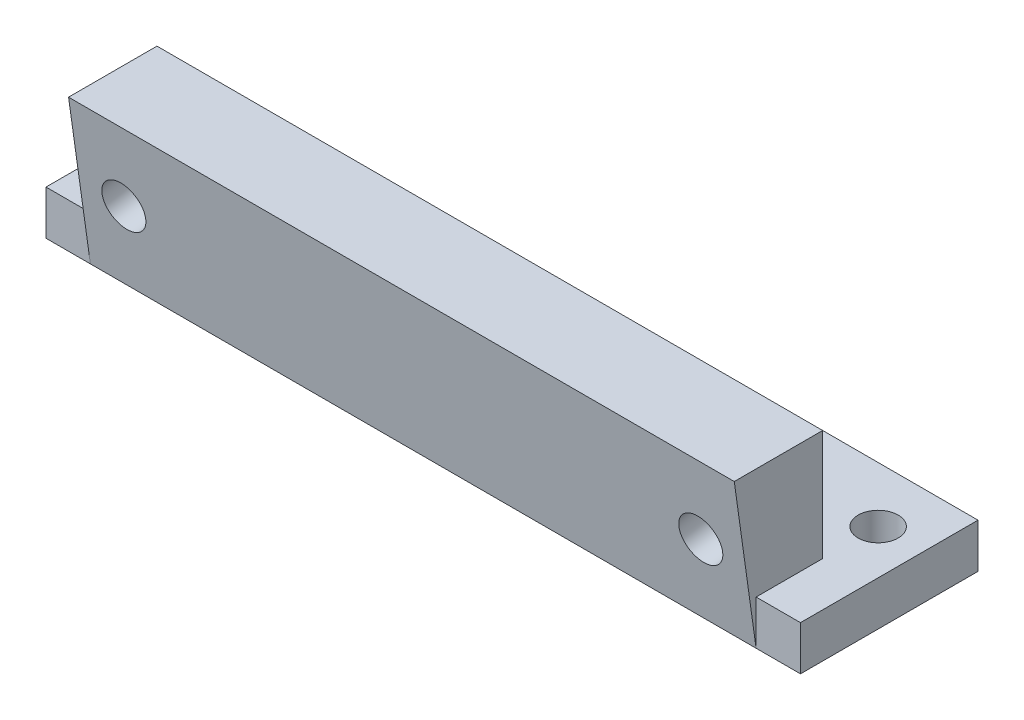
ISO-10303-21;
HEADER;
FILE_DESCRIPTION(('STEP AP214'),'2;1');
FILE_NAME('part.step','',(''),(''),'','','');
FILE_SCHEMA(('AUTOMOTIVE_DESIGN { 1 0 10303 214 1 1 1 1 }'));
ENDSEC;
DATA;
#1=APPLICATION_CONTEXT('core data for automotive mechanical design processes');
#2=APPLICATION_PROTOCOL_DEFINITION('international standard','automotive_design',2000,#1);
#3=PRODUCT_CONTEXT('',#1,'mechanical');
#4=PRODUCT('Part','Part','',(#3));
#5=PRODUCT_RELATED_PRODUCT_CATEGORY('part','',(#4));
#6=PRODUCT_DEFINITION_FORMATION('','',#4);
#7=PRODUCT_DEFINITION_CONTEXT('part definition',#1,'design');
#8=PRODUCT_DEFINITION('design','',#6,#7);
#9=PRODUCT_DEFINITION_SHAPE('','',#8);
#10=(LENGTH_UNIT() NAMED_UNIT(*) SI_UNIT(.MILLI.,.METRE.));
#11=(NAMED_UNIT(*) PLANE_ANGLE_UNIT() SI_UNIT($,.RADIAN.));
#12=(NAMED_UNIT(*) SI_UNIT($,.STERADIAN.) SOLID_ANGLE_UNIT());
#13=UNCERTAINTY_MEASURE_WITH_UNIT(LENGTH_MEASURE(1.E-05),#10,'distance_accuracy_value','');
#14=(GEOMETRIC_REPRESENTATION_CONTEXT(3) GLOBAL_UNCERTAINTY_ASSIGNED_CONTEXT((#13)) GLOBAL_UNIT_ASSIGNED_CONTEXT((#10,
#11,#12)) REPRESENTATION_CONTEXT('',''));
#15=CARTESIAN_POINT('',(0.,0.,0.));
#16=DIRECTION('',(0.,0.,1.));
#17=DIRECTION('',(1.,0.,0.));
#18=AXIS2_PLACEMENT_3D('',#15,#16,#17);
#19=CARTESIAN_POINT('',(-21.59,2.54,5.08));
#20=DIRECTION('',(0.,0.,-1.));
#21=DIRECTION('',(-1.,0.,0.));
#22=AXIS2_PLACEMENT_3D('',#19,#20,#21);
#23=PLANE('',#22);
#24=DIRECTION('',(0.,1.,0.));
#25=VECTOR('',#24,1.);
#26=CARTESIAN_POINT('',(19.05,0.,5.08));
#27=LINE('',#26,#25);
#28=CARTESIAN_POINT('',(19.05,0.,5.08));
#29=VERTEX_POINT('',#28);
#30=CARTESIAN_POINT('',(19.05,2.54,5.08));
#31=VERTEX_POINT('',#30);
#32=EDGE_CURVE('E50',#29,#31,#27,.T.);
#33=ORIENTED_EDGE('',*,*,#32,.F.);
#34=DIRECTION('',(1.,0.,0.));
#35=VECTOR('',#34,1.);
#36=CARTESIAN_POINT('',(-21.59,0.,5.08));
#37=LINE('',#36,#35);
#38=CARTESIAN_POINT('',(21.59,0.,5.08));
#39=VERTEX_POINT('',#38);
#40=EDGE_CURVE('E117',#29,#39,#37,.T.);
#41=ORIENTED_EDGE('',*,*,#40,.T.);
#42=DIRECTION('',(0.,-1.,0.));
#43=VECTOR('',#42,1.);
#44=CARTESIAN_POINT('',(21.59,2.54,5.08));
#45=LINE('',#44,#43);
#46=CARTESIAN_POINT('',(21.59,2.54,5.08));
#47=VERTEX_POINT('',#46);
#48=EDGE_CURVE('E170',#47,#39,#45,.T.);
#49=ORIENTED_EDGE('',*,*,#48,.F.);
#50=DIRECTION('',(1.,0.,0.));
#51=VECTOR('',#50,1.);
#52=CARTESIAN_POINT('',(-21.59,2.54,5.08));
#53=LINE('',#52,#51);
#54=EDGE_CURVE('E183',#31,#47,#53,.T.);
#55=ORIENTED_EDGE('',*,*,#54,.F.);
#56=EDGE_LOOP('',(#33,#41,#49,#55));
#57=FACE_BOUND('',#56,.T.);
#58=ADVANCED_FACE('F33',(#57),#23,.F.);
#59=DIRECTION('',(0.,-1.,0.));
#60=VECTOR('',#59,1.);
#61=CARTESIAN_POINT('',(-19.05,0.,5.08));
#62=LINE('',#61,#60);
#63=CARTESIAN_POINT('',(-19.05,2.54,5.08));
#64=VERTEX_POINT('',#63);
#65=CARTESIAN_POINT('',(-19.05,0.,5.08));
#66=VERTEX_POINT('',#65);
#67=EDGE_CURVE('E11',#64,#66,#62,.T.);
#68=ORIENTED_EDGE('',*,*,#67,.F.);
#69=CARTESIAN_POINT('',(-21.59,2.54,5.08));
#70=VERTEX_POINT('',#69);
#71=EDGE_CURVE('E174',#70,#64,#53,.T.);
#72=ORIENTED_EDGE('',*,*,#71,.F.);
#73=DIRECTION('',(0.,-1.,0.));
#74=VECTOR('',#73,1.);
#75=CARTESIAN_POINT('',(-21.59,2.54,5.08));
#76=LINE('',#75,#74);
#77=CARTESIAN_POINT('',(-21.59,0.,5.08));
#78=VERTEX_POINT('',#77);
#79=EDGE_CURVE('E113',#70,#78,#76,.T.);
#80=ORIENTED_EDGE('',*,*,#79,.T.);
#81=EDGE_CURVE('E108',#78,#66,#37,.T.);
#82=ORIENTED_EDGE('',*,*,#81,.T.);
#83=EDGE_LOOP('',(#68,#72,#80,#82));
#84=FACE_BOUND('',#83,.T.);
#85=ADVANCED_FACE('F110',(#84),#23,.F.);
#86=CARTESIAN_POINT('',(0.,2.54,0.));
#87=DIRECTION('',(0.,-1.,0.));
#88=DIRECTION('',(0.,0.,-1.));
#89=AXIS2_PLACEMENT_3D('',#86,#87,#88);
#90=PLANE('',#89);
#91=CARTESIAN_POINT('',(-19.05,2.54,-1.905));
#92=DIRECTION('',(0.,1.,0.));
#93=DIRECTION('',(0.,0.,1.));
#94=AXIS2_PLACEMENT_3D('',#91,#92,#93);
#95=CIRCLE('',#94,1.143);
#96=CARTESIAN_POINT('',(-19.05,2.54,-0.762000000000006));
#97=VERTEX_POINT('',#96);
#98=EDGE_CURVE('E148',#97,#97,#95,.T.);
#99=ORIENTED_EDGE('',*,*,#98,.F.);
#100=EDGE_LOOP('',(#99));
#101=FACE_BOUND('',#100,.T.);
#102=CARTESIAN_POINT('',(19.05,2.54,-1.90500000000001));
#103=DIRECTION('',(0.,1.,0.));
#104=DIRECTION('',(0.,0.,1.));
#105=AXIS2_PLACEMENT_3D('',#102,#103,#104);
#106=CIRCLE('',#105,1.143);
#107=CARTESIAN_POINT('',(19.05,2.54,-0.76200000000001));
#108=VERTEX_POINT('',#107);
#109=EDGE_CURVE('E234',#108,#108,#106,.T.);
#110=ORIENTED_EDGE('',*,*,#109,.F.);
#111=EDGE_LOOP('',(#110));
#112=FACE_BOUND('',#111,.T.);
#113=DIRECTION('',(0.,0.,1.));
#114=VECTOR('',#113,1.);
#115=CARTESIAN_POINT('',(-19.05,2.54,5.08));
#116=LINE('',#115,#114);
#117=CARTESIAN_POINT('',(-19.05,2.54,1.27));
#118=VERTEX_POINT('',#117);
#119=EDGE_CURVE('E58',#118,#64,#116,.T.);
#120=ORIENTED_EDGE('',*,*,#119,.F.);
#121=DIRECTION('',(-1.,0.,0.));
#122=VECTOR('',#121,1.);
#123=CARTESIAN_POINT('',(-19.05,2.54,1.27));
#124=LINE('',#123,#122);
#125=CARTESIAN_POINT('',(19.05,2.54,1.27));
#126=VERTEX_POINT('',#125);
#127=EDGE_CURVE('E214',#126,#118,#124,.T.);
#128=ORIENTED_EDGE('',*,*,#127,.F.);
#129=DIRECTION('',(0.,0.,-1.));
#130=VECTOR('',#129,1.);
#131=CARTESIAN_POINT('',(19.05,2.54,5.08));
#132=LINE('',#131,#130);
#133=EDGE_CURVE('E217',#31,#126,#132,.T.);
#134=ORIENTED_EDGE('',*,*,#133,.F.);
#135=ORIENTED_EDGE('',*,*,#54,.T.);
#136=DIRECTION('',(0.,0.,-1.));
#137=VECTOR('',#136,1.);
#138=CARTESIAN_POINT('',(21.59,2.54,5.08));
#139=LINE('',#138,#137);
#140=CARTESIAN_POINT('',(21.59,2.54,-5.08));
#141=VERTEX_POINT('',#140);
#142=EDGE_CURVE('E116',#47,#141,#139,.T.);
#143=ORIENTED_EDGE('',*,*,#142,.T.);
#144=DIRECTION('',(-1.,0.,0.));
#145=VECTOR('',#144,1.);
#146=CARTESIAN_POINT('',(-21.59,2.54,-5.08));
#147=LINE('',#146,#145);
#148=CARTESIAN_POINT('',(-21.59,2.54,-5.08));
#149=VERTEX_POINT('',#148);
#150=EDGE_CURVE('E202',#141,#149,#147,.T.);
#151=ORIENTED_EDGE('',*,*,#150,.T.);
#152=DIRECTION('',(0.,0.,1.));
#153=VECTOR('',#152,1.);
#154=CARTESIAN_POINT('',(-21.59,2.54,5.08));
#155=LINE('',#154,#153);
#156=EDGE_CURVE('E188',#149,#70,#155,.T.);
#157=ORIENTED_EDGE('',*,*,#156,.T.);
#158=ORIENTED_EDGE('',*,*,#71,.T.);
#159=EDGE_LOOP('',(#120,#128,#134,#135,#143,#151,#157,#158));
#160=FACE_BOUND('',#159,.T.);
#161=ADVANCED_FACE('F249',(#101,#112,#160),#90,.F.);
#162=CARTESIAN_POINT('',(21.59,2.54,5.08));
#163=DIRECTION('',(-1.,0.,0.));
#164=DIRECTION('',(0.,0.,1.));
#165=AXIS2_PLACEMENT_3D('',#162,#163,#164);
#166=PLANE('',#165);
#167=DIRECTION('',(0.,0.,-1.));
#168=VECTOR('',#167,1.);
#169=CARTESIAN_POINT('',(21.59,0.,5.08));
#170=LINE('',#169,#168);
#171=CARTESIAN_POINT('',(21.59,0.,-5.08));
#172=VERTEX_POINT('',#171);
#173=EDGE_CURVE('E190',#39,#172,#170,.T.);
#174=ORIENTED_EDGE('',*,*,#173,.T.);
#175=DIRECTION('',(0.,-1.,0.));
#176=VECTOR('',#175,1.);
#177=CARTESIAN_POINT('',(21.59,2.54,-5.08));
#178=LINE('',#177,#176);
#179=EDGE_CURVE('E42',#141,#172,#178,.T.);
#180=ORIENTED_EDGE('',*,*,#179,.F.);
#181=ORIENTED_EDGE('',*,*,#142,.F.);
#182=ORIENTED_EDGE('',*,*,#48,.T.);
#183=EDGE_LOOP('',(#174,#180,#181,#182));
#184=FACE_BOUND('',#183,.T.);
#185=ADVANCED_FACE('F35',(#184),#166,.F.);
#186=CARTESIAN_POINT('',(-21.59,2.54,-5.08));
#187=DIRECTION('',(0.,0.,1.));
#188=DIRECTION('',(1.,0.,0.));
#189=AXIS2_PLACEMENT_3D('',#186,#187,#188);
#190=PLANE('',#189);
#191=DIRECTION('',(-1.,0.,0.));
#192=VECTOR('',#191,1.);
#193=CARTESIAN_POINT('',(-21.59,0.,-5.08));
#194=LINE('',#193,#192);
#195=CARTESIAN_POINT('',(-21.59,0.,-5.08));
#196=VERTEX_POINT('',#195);
#197=EDGE_CURVE('E193',#172,#196,#194,.T.);
#198=ORIENTED_EDGE('',*,*,#197,.T.);
#199=DIRECTION('',(0.,-1.,0.));
#200=VECTOR('',#199,1.);
#201=CARTESIAN_POINT('',(-21.59,2.54,-5.08));
#202=LINE('',#201,#200);
#203=EDGE_CURVE('E176',#149,#196,#202,.T.);
#204=ORIENTED_EDGE('',*,*,#203,.F.);
#205=ORIENTED_EDGE('',*,*,#150,.F.);
#206=ORIENTED_EDGE('',*,*,#179,.T.);
#207=EDGE_LOOP('',(#198,#204,#205,#206));
#208=FACE_BOUND('',#207,.T.);
#209=ADVANCED_FACE('F201',(#208),#190,.F.);
#210=CARTESIAN_POINT('',(-21.59,2.54,5.08));
#211=DIRECTION('',(1.,0.,0.));
#212=DIRECTION('',(0.,0.,-1.));
#213=AXIS2_PLACEMENT_3D('',#210,#211,#212);
#214=PLANE('',#213);
#215=DIRECTION('',(0.,0.,1.));
#216=VECTOR('',#215,1.);
#217=CARTESIAN_POINT('',(-21.59,0.,5.08));
#218=LINE('',#217,#216);
#219=EDGE_CURVE('E164',#196,#78,#218,.T.);
#220=ORIENTED_EDGE('',*,*,#219,.T.);
#221=ORIENTED_EDGE('',*,*,#79,.F.);
#222=ORIENTED_EDGE('',*,*,#156,.F.);
#223=ORIENTED_EDGE('',*,*,#203,.T.);
#224=EDGE_LOOP('',(#220,#221,#222,#223));
#225=FACE_BOUND('',#224,.T.);
#226=ADVANCED_FACE('F198',(#225),#214,.F.);
#227=CARTESIAN_POINT('',(0.,0.,0.));
#228=DIRECTION('',(0.,-1.,0.));
#229=DIRECTION('',(0.,0.,-1.));
#230=AXIS2_PLACEMENT_3D('',#227,#228,#229);
#231=PLANE('',#230);
#232=CARTESIAN_POINT('',(-19.05,0.,-1.905));
#233=DIRECTION('',(0.,1.,0.));
#234=DIRECTION('',(0.,0.,1.));
#235=AXIS2_PLACEMENT_3D('',#232,#233,#234);
#236=CIRCLE('',#235,1.143);
#237=CARTESIAN_POINT('',(-19.05,0.,-0.762000000000006));
#238=VERTEX_POINT('',#237);
#239=EDGE_CURVE('E151',#238,#238,#236,.T.);
#240=ORIENTED_EDGE('',*,*,#239,.T.);
#241=EDGE_LOOP('',(#240));
#242=FACE_BOUND('',#241,.T.);
#243=CARTESIAN_POINT('',(19.05,0.,-1.90500000000001));
#244=DIRECTION('',(0.,1.,0.));
#245=DIRECTION('',(0.,0.,1.));
#246=AXIS2_PLACEMENT_3D('',#243,#244,#245);
#247=CIRCLE('',#246,1.143);
#248=CARTESIAN_POINT('',(19.05,0.,-0.76200000000001));
#249=VERTEX_POINT('',#248);
#250=EDGE_CURVE('E222',#249,#249,#247,.T.);
#251=ORIENTED_EDGE('',*,*,#250,.T.);
#252=EDGE_LOOP('',(#251));
#253=FACE_BOUND('',#252,.T.);
#254=ORIENTED_EDGE('',*,*,#173,.F.);
#255=ORIENTED_EDGE('',*,*,#40,.F.);
#256=DIRECTION('',(-1.,0.,0.));
#257=VECTOR('',#256,1.);
#258=CARTESIAN_POINT('',(28.0273671196905,0.,5.08));
#259=LINE('',#258,#257);
#260=EDGE_CURVE('E120',#29,#66,#259,.T.);
#261=ORIENTED_EDGE('',*,*,#260,.T.);
#262=ORIENTED_EDGE('',*,*,#81,.F.);
#263=ORIENTED_EDGE('',*,*,#219,.F.);
#264=ORIENTED_EDGE('',*,*,#197,.F.);
#265=EDGE_LOOP('',(#254,#255,#261,#262,#263,#264));
#266=FACE_BOUND('',#265,.T.);
#267=ADVANCED_FACE('F122',(#242,#253,#266),#231,.T.);
#268=CARTESIAN_POINT('',(-19.05,8.89,5.08));
#269=DIRECTION('',(1.,0.,0.));
#270=DIRECTION('',(0.,0.,-1.));
#271=AXIS2_PLACEMENT_3D('',#268,#269,#270);
#272=PLANE('',#271);
#273=ORIENTED_EDGE('',*,*,#119,.T.);
#274=ORIENTED_EDGE('',*,*,#67,.T.);
#275=DIRECTION('',(0.,0.990268068741571,0.139173100960058));
#276=VECTOR('',#275,1.);
#277=CARTESIAN_POINT('',(-19.05,8.89,6.3294080205042));
#278=LINE('',#277,#276);
#279=CARTESIAN_POINT('',(-19.05,8.89,6.3294080205042));
#280=VERTEX_POINT('',#279);
#281=EDGE_CURVE('E128',#66,#280,#278,.T.);
#282=ORIENTED_EDGE('',*,*,#281,.T.);
#283=DIRECTION('',(0.,0.,1.));
#284=VECTOR('',#283,1.);
#285=CARTESIAN_POINT('',(-19.05,8.89,5.08));
#286=LINE('',#285,#284);
#287=CARTESIAN_POINT('',(-19.05,8.89,1.27));
#288=VERTEX_POINT('',#287);
#289=EDGE_CURVE('E216',#288,#280,#286,.T.);
#290=ORIENTED_EDGE('',*,*,#289,.F.);
#291=DIRECTION('',(0.,-1.,0.));
#292=VECTOR('',#291,1.);
#293=CARTESIAN_POINT('',(-19.05,8.89,1.27));
#294=LINE('',#293,#292);
#295=EDGE_CURVE('E211',#288,#118,#294,.T.);
#296=ORIENTED_EDGE('',*,*,#295,.T.);
#297=EDGE_LOOP('',(#273,#274,#282,#290,#296));
#298=FACE_BOUND('',#297,.T.);
#299=ADVANCED_FACE('F132',(#298),#272,.F.);
#300=CARTESIAN_POINT('',(19.05,8.89,5.08));
#301=DIRECTION('',(-1.,0.,0.));
#302=DIRECTION('',(0.,0.,1.));
#303=AXIS2_PLACEMENT_3D('',#300,#301,#302);
#304=PLANE('',#303);
#305=ORIENTED_EDGE('',*,*,#133,.T.);
#306=DIRECTION('',(0.,-1.,0.));
#307=VECTOR('',#306,1.);
#308=CARTESIAN_POINT('',(19.05,8.89,1.27));
#309=LINE('',#308,#307);
#310=CARTESIAN_POINT('',(19.05,8.89,1.27));
#311=VERTEX_POINT('',#310);
#312=EDGE_CURVE('E194',#311,#126,#309,.T.);
#313=ORIENTED_EDGE('',*,*,#312,.F.);
#314=DIRECTION('',(0.,0.,-1.));
#315=VECTOR('',#314,1.);
#316=CARTESIAN_POINT('',(19.05,8.89,5.08));
#317=LINE('',#316,#315);
#318=CARTESIAN_POINT('',(19.05,8.89,6.3294080205042));
#319=VERTEX_POINT('',#318);
#320=EDGE_CURVE('E231',#319,#311,#317,.T.);
#321=ORIENTED_EDGE('',*,*,#320,.F.);
#322=DIRECTION('',(0.,-0.990268068741571,-0.139173100960058));
#323=VECTOR('',#322,1.);
#324=CARTESIAN_POINT('',(19.05,8.89,6.3294080205042));
#325=LINE('',#324,#323);
#326=EDGE_CURVE('E147',#319,#29,#325,.T.);
#327=ORIENTED_EDGE('',*,*,#326,.T.);
#328=ORIENTED_EDGE('',*,*,#32,.T.);
#329=EDGE_LOOP('',(#305,#313,#321,#327,#328));
#330=FACE_BOUND('',#329,.T.);
#331=ADVANCED_FACE('F225',(#330),#304,.F.);
#332=CARTESIAN_POINT('',(-19.05,8.89,1.27));
#333=DIRECTION('',(0.,0.,1.));
#334=DIRECTION('',(1.,0.,0.));
#335=AXIS2_PLACEMENT_3D('',#332,#333,#334);
#336=PLANE('',#335);
#337=CARTESIAN_POINT('',(16.51,5.06825700325887,1.27));
#338=DIRECTION('',(0.,0.,1.));
#339=DIRECTION('',(0.,-1.,0.));
#340=AXIS2_PLACEMENT_3D('',#337,#338,#339);
#341=ELLIPSE('',#340,1.26228446564827,1.25);
#342=CARTESIAN_POINT('',(16.51,3.8059725376106,1.27));
#343=VERTEX_POINT('',#342);
#344=EDGE_CURVE('E404',#343,#343,#341,.T.);
#345=ORIENTED_EDGE('',*,*,#344,.T.);
#346=EDGE_LOOP('',(#345));
#347=FACE_BOUND('',#346,.T.);
#348=CARTESIAN_POINT('',(-16.51,5.06825700325884,1.27));
#349=DIRECTION('',(0.,0.,1.));
#350=DIRECTION('',(0.,-1.,0.));
#351=AXIS2_PLACEMENT_3D('',#348,#349,#350);
#352=ELLIPSE('',#351,1.26228446564827,1.25);
#353=CARTESIAN_POINT('',(-16.51,3.80597253761057,1.27));
#354=VERTEX_POINT('',#353);
#355=EDGE_CURVE('E138',#354,#354,#352,.T.);
#356=ORIENTED_EDGE('',*,*,#355,.T.);
#357=EDGE_LOOP('',(#356));
#358=FACE_BOUND('',#357,.T.);
#359=ORIENTED_EDGE('',*,*,#127,.T.);
#360=ORIENTED_EDGE('',*,*,#295,.F.);
#361=DIRECTION('',(-1.,0.,0.));
#362=VECTOR('',#361,1.);
#363=CARTESIAN_POINT('',(-19.05,8.89,1.27));
#364=LINE('',#363,#362);
#365=EDGE_CURVE('E213',#311,#288,#364,.T.);
#366=ORIENTED_EDGE('',*,*,#365,.F.);
#367=ORIENTED_EDGE('',*,*,#312,.T.);
#368=EDGE_LOOP('',(#359,#360,#366,#367));
#369=FACE_BOUND('',#368,.T.);
#370=ADVANCED_FACE('F228',(#347,#358,#369),#336,.F.);
#371=CARTESIAN_POINT('',(0.,8.89,0.));
#372=DIRECTION('',(0.,-1.,0.));
#373=DIRECTION('',(0.,0.,-1.));
#374=AXIS2_PLACEMENT_3D('',#371,#372,#373);
#375=PLANE('',#374);
#376=ORIENTED_EDGE('',*,*,#289,.T.);
#377=DIRECTION('',(-1.,0.,0.));
#378=VECTOR('',#377,1.);
#379=CARTESIAN_POINT('',(28.0273671196905,8.89,6.3294080205042));
#380=LINE('',#379,#378);
#381=EDGE_CURVE('E127',#319,#280,#380,.T.);
#382=ORIENTED_EDGE('',*,*,#381,.F.);
#383=ORIENTED_EDGE('',*,*,#320,.T.);
#384=ORIENTED_EDGE('',*,*,#365,.T.);
#385=EDGE_LOOP('',(#376,#382,#383,#384));
#386=FACE_BOUND('',#385,.T.);
#387=ADVANCED_FACE('F245',(#386),#375,.F.);
#388=CARTESIAN_POINT('',(19.05,0.,-1.90500000000001));
#389=DIRECTION('',(0.,1.,0.));
#390=DIRECTION('',(0.,0.,1.));
#391=AXIS2_PLACEMENT_3D('',#388,#389,#390);
#392=CYLINDRICAL_SURFACE('',#391,1.143);
#393=ORIENTED_EDGE('',*,*,#250,.F.);
#394=EDGE_LOOP('',(#393));
#395=FACE_BOUND('',#394,.T.);
#396=ORIENTED_EDGE('',*,*,#109,.T.);
#397=EDGE_LOOP('',(#396));
#398=FACE_BOUND('',#397,.T.);
#399=ADVANCED_FACE('F241',(#395,#398),#392,.F.);
#400=CARTESIAN_POINT('',(-19.05,0.,-1.905));
#401=DIRECTION('',(0.,1.,0.));
#402=DIRECTION('',(0.,0.,1.));
#403=AXIS2_PLACEMENT_3D('',#400,#401,#402);
#404=CYLINDRICAL_SURFACE('',#403,1.143);
#405=ORIENTED_EDGE('',*,*,#239,.F.);
#406=EDGE_LOOP('',(#405));
#407=FACE_BOUND('',#406,.T.);
#408=ORIENTED_EDGE('',*,*,#98,.T.);
#409=EDGE_LOOP('',(#408));
#410=FACE_BOUND('',#409,.T.);
#411=ADVANCED_FACE('F244',(#407,#410),#404,.F.);
#412=CARTESIAN_POINT('',(28.0273671196905,8.89,6.3294080205042));
#413=DIRECTION('',(0.,-0.139173100960058,0.990268068741571));
#414=DIRECTION('',(0.,-0.990268068741571,-0.139173100960058));
#415=AXIS2_PLACEMENT_3D('',#412,#413,#414);
#416=PLANE('',#415);
#417=CARTESIAN_POINT('',(16.51,4.44500000000003,5.70470401025211));
#418=DIRECTION('',(0.,-0.139173100960058,0.990268068741571));
#419=DIRECTION('',(0.,0.990268068741571,0.139173100960058));
#420=AXIS2_PLACEMENT_3D('',#417,#418,#419);
#421=CIRCLE('',#420,1.25);
#422=CARTESIAN_POINT('',(16.51,5.68283508592699,5.87867038645218));
#423=VERTEX_POINT('',#422);
#424=EDGE_CURVE('E401',#423,#423,#421,.T.);
#425=ORIENTED_EDGE('',*,*,#424,.F.);
#426=EDGE_LOOP('',(#425));
#427=FACE_BOUND('',#426,.T.);
#428=CARTESIAN_POINT('',(-16.51,4.445,5.7047040102521));
#429=DIRECTION('',(0.,-0.139173100960058,0.990268068741571));
#430=DIRECTION('',(0.,-0.990268068741571,-0.139173100960058));
#431=AXIS2_PLACEMENT_3D('',#428,#429,#430);
#432=CIRCLE('',#431,1.25);
#433=CARTESIAN_POINT('',(-16.51,3.20716491407304,5.53073763405203));
#434=VERTEX_POINT('',#433);
#435=EDGE_CURVE('E141',#434,#434,#432,.T.);
#436=ORIENTED_EDGE('',*,*,#435,.F.);
#437=EDGE_LOOP('',(#436));
#438=FACE_BOUND('',#437,.T.);
#439=ORIENTED_EDGE('',*,*,#326,.F.);
#440=ORIENTED_EDGE('',*,*,#381,.T.);
#441=ORIENTED_EDGE('',*,*,#281,.F.);
#442=ORIENTED_EDGE('',*,*,#260,.F.);
#443=EDGE_LOOP('',(#439,#440,#441,#442));
#444=FACE_BOUND('',#443,.T.);
#445=ADVANCED_FACE('F136',(#427,#438,#444),#416,.T.);
#446=CARTESIAN_POINT('',(-16.51,6.01743001333324,-5.48371689718803));
#447=DIRECTION('',(0.,-0.139173100960058,0.990268068741571));
#448=DIRECTION('',(0.,-0.990268068741571,-0.139173100960058));
#449=AXIS2_PLACEMENT_3D('',#446,#447,#448);
#450=CYLINDRICAL_SURFACE('',#449,1.25);
#451=ORIENTED_EDGE('',*,*,#435,.T.);
#452=EDGE_LOOP('',(#451));
#453=FACE_BOUND('',#452,.T.);
#454=ORIENTED_EDGE('',*,*,#355,.F.);
#455=EDGE_LOOP('',(#454));
#456=FACE_BOUND('',#455,.T.);
#457=ADVANCED_FACE('F322',(#453,#456),#450,.F.);
#458=CARTESIAN_POINT('',(16.51,6.01743001333327,-5.48371689718803));
#459=DIRECTION('',(0.,-0.139173100960058,0.990268068741571));
#460=DIRECTION('',(0.,-0.990268068741571,-0.139173100960058));
#461=AXIS2_PLACEMENT_3D('',#458,#459,#460);
#462=CYLINDRICAL_SURFACE('',#461,1.25);
#463=ORIENTED_EDGE('',*,*,#424,.T.);
#464=EDGE_LOOP('',(#463));
#465=FACE_BOUND('',#464,.T.);
#466=ORIENTED_EDGE('',*,*,#344,.F.);
#467=EDGE_LOOP('',(#466));
#468=FACE_BOUND('',#467,.T.);
#469=ADVANCED_FACE('F330',(#465,#468),#462,.F.);
#470=CLOSED_SHELL('',(#58,#85,#161,#185,#209,#226,#267,#299,#331,#370,#387,#399,#411,#445,#457,#469));
#471=MANIFOLD_SOLID_BREP('B2',#470);
#472=ADVANCED_BREP_SHAPE_REPRESENTATION('',(#18,#471),#14);
#473=SHAPE_DEFINITION_REPRESENTATION(#9,#472);
ENDSEC;
END-ISO-10303-21;
